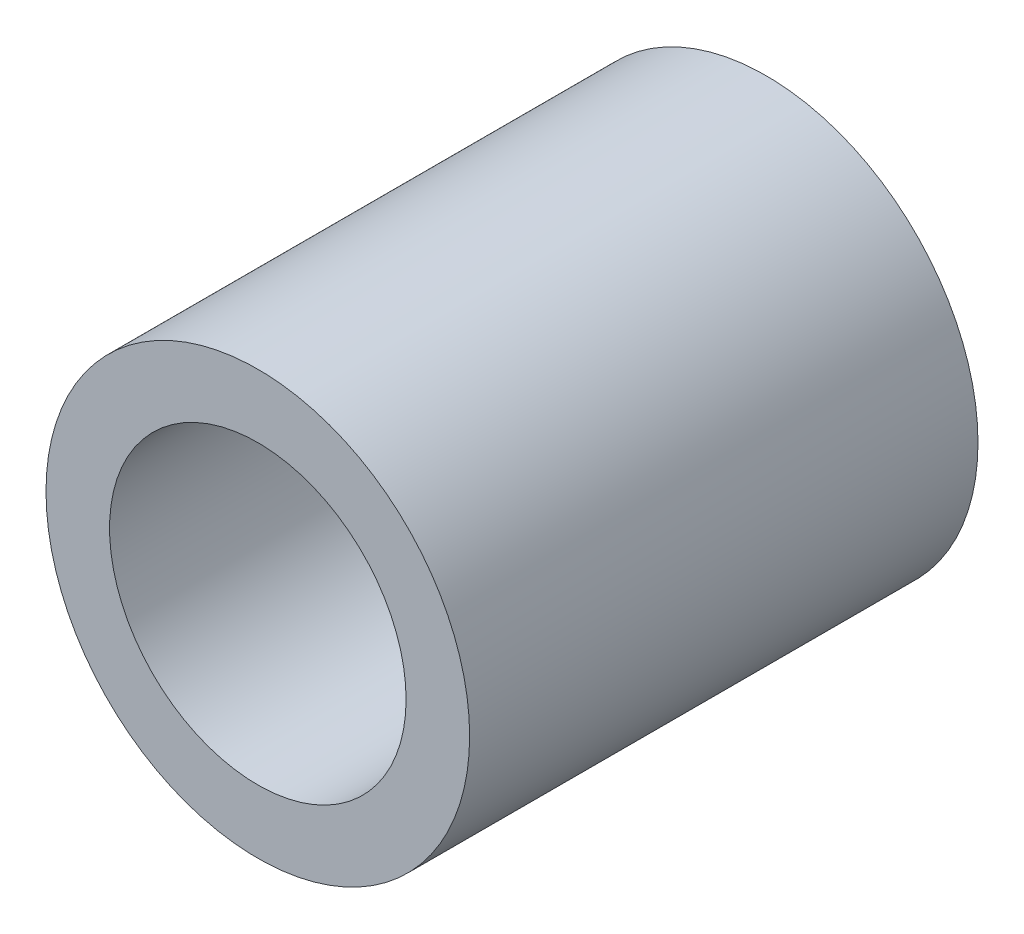
ISO-10303-21;
HEADER;
FILE_DESCRIPTION(('STEP AP214'),'2;1');
FILE_NAME('part.step','',(''),(''),'','','');
FILE_SCHEMA(('AUTOMOTIVE_DESIGN { 1 0 10303 214 1 1 1 1 }'));
ENDSEC;
DATA;
#1=APPLICATION_CONTEXT('core data for automotive mechanical design processes');
#2=APPLICATION_PROTOCOL_DEFINITION('international standard','automotive_design',2000,#1);
#3=PRODUCT_CONTEXT('',#1,'mechanical');
#4=PRODUCT('Part','Part','',(#3));
#5=PRODUCT_RELATED_PRODUCT_CATEGORY('part','',(#4));
#6=PRODUCT_DEFINITION_FORMATION('','',#4);
#7=PRODUCT_DEFINITION_CONTEXT('part definition',#1,'design');
#8=PRODUCT_DEFINITION('design','',#6,#7);
#9=PRODUCT_DEFINITION_SHAPE('','',#8);
#10=(LENGTH_UNIT() NAMED_UNIT(*) SI_UNIT(.MILLI.,.METRE.));
#11=(NAMED_UNIT(*) PLANE_ANGLE_UNIT() SI_UNIT($,.RADIAN.));
#12=(NAMED_UNIT(*) SI_UNIT($,.STERADIAN.) SOLID_ANGLE_UNIT());
#13=UNCERTAINTY_MEASURE_WITH_UNIT(LENGTH_MEASURE(1.E-05),#10,'distance_accuracy_value','');
#14=(GEOMETRIC_REPRESENTATION_CONTEXT(3) GLOBAL_UNCERTAINTY_ASSIGNED_CONTEXT((#13)) GLOBAL_UNIT_ASSIGNED_CONTEXT((#10,
#11,#12)) REPRESENTATION_CONTEXT('',''));
#15=CARTESIAN_POINT('',(0.,0.,0.));
#16=DIRECTION('',(0.,0.,1.));
#17=DIRECTION('',(1.,0.,0.));
#18=AXIS2_PLACEMENT_3D('',#15,#16,#17);
#19=CARTESIAN_POINT('',(0.,0.,0.));
#20=DIRECTION('',(0.,0.,-1.));
#21=DIRECTION('',(1.,0.,0.));
#22=AXIS2_PLACEMENT_3D('',#19,#20,#21);
#23=CYLINDRICAL_SURFACE('',#22,1.75);
#24=CARTESIAN_POINT('',(0.,0.,0.));
#25=DIRECTION('',(0.,0.,1.));
#26=DIRECTION('',(1.,0.,0.));
#27=AXIS2_PLACEMENT_3D('',#24,#25,#26);
#28=CIRCLE('',#27,1.75);
#29=CARTESIAN_POINT('',(1.75,0.,0.));
#30=VERTEX_POINT('',#29);
#31=EDGE_CURVE('E61',#30,#30,#28,.T.);
#32=ORIENTED_EDGE('',*,*,#31,.F.);
#33=DIRECTION('',(0.,0.,1.));
#34=VECTOR('',#33,1.);
#35=CARTESIAN_POINT('',(1.75,0.,0.));
#36=LINE('',#35,#34);
#37=CARTESIAN_POINT('',(1.75,0.,6.));
#38=VERTEX_POINT('',#37);
#39=EDGE_CURVE('E10',#30,#38,#36,.T.);
#40=ORIENTED_EDGE('',*,*,#39,.T.);
#41=CARTESIAN_POINT('',(0.,0.,6.));
#42=DIRECTION('',(0.,0.,-1.));
#43=DIRECTION('',(1.,0.,0.));
#44=AXIS2_PLACEMENT_3D('',#41,#42,#43);
#45=CIRCLE('',#44,1.75);
#46=EDGE_CURVE('E23',#38,#38,#45,.T.);
#47=ORIENTED_EDGE('',*,*,#46,.F.);
#48=ORIENTED_EDGE('',*,*,#39,.F.);
#49=EDGE_LOOP('',(#32,#40,#47,#48));
#50=FACE_BOUND('',#49,.T.);
#51=ADVANCED_FACE('F15',(#50),#23,.F.);
#52=CARTESIAN_POINT('',(0.,0.,6.));
#53=DIRECTION('',(0.,0.,1.));
#54=DIRECTION('',(1.,0.,0.));
#55=AXIS2_PLACEMENT_3D('',#52,#53,#54);
#56=PLANE('',#55);
#57=ORIENTED_EDGE('',*,*,#46,.T.);
#58=EDGE_LOOP('',(#57));
#59=FACE_BOUND('',#58,.T.);
#60=CARTESIAN_POINT('',(0.,0.,6.));
#61=DIRECTION('',(0.,0.,1.));
#62=DIRECTION('',(1.,0.,0.));
#63=AXIS2_PLACEMENT_3D('',#60,#61,#62);
#64=CIRCLE('',#63,2.5);
#65=CARTESIAN_POINT('',(2.5,0.,6.));
#66=VERTEX_POINT('',#65);
#67=EDGE_CURVE('E55',#66,#66,#64,.T.);
#68=ORIENTED_EDGE('',*,*,#67,.T.);
#69=EDGE_LOOP('',(#68));
#70=FACE_BOUND('',#69,.T.);
#71=ADVANCED_FACE('F69',(#59,#70),#56,.T.);
#72=CARTESIAN_POINT('',(0.,0.,0.));
#73=DIRECTION('',(0.,0.,1.));
#74=DIRECTION('',(1.,0.,0.));
#75=AXIS2_PLACEMENT_3D('',#72,#73,#74);
#76=PLANE('',#75);
#77=ORIENTED_EDGE('',*,*,#31,.T.);
#78=EDGE_LOOP('',(#77));
#79=FACE_BOUND('',#78,.T.);
#80=CARTESIAN_POINT('',(0.,0.,0.));
#81=DIRECTION('',(0.,0.,1.));
#82=DIRECTION('',(1.,0.,0.));
#83=AXIS2_PLACEMENT_3D('',#80,#81,#82);
#84=CIRCLE('',#83,2.5);
#85=CARTESIAN_POINT('',(2.5,0.,0.));
#86=VERTEX_POINT('',#85);
#87=EDGE_CURVE('E54',#86,#86,#84,.T.);
#88=ORIENTED_EDGE('',*,*,#87,.F.);
#89=EDGE_LOOP('',(#88));
#90=FACE_BOUND('',#89,.T.);
#91=ADVANCED_FACE('F76',(#79,#90),#76,.F.);
#92=CARTESIAN_POINT('',(0.,0.,0.));
#93=DIRECTION('',(0.,0.,-1.));
#94=DIRECTION('',(1.,0.,0.));
#95=AXIS2_PLACEMENT_3D('',#92,#93,#94);
#96=CYLINDRICAL_SURFACE('',#95,2.5);
#97=ORIENTED_EDGE('',*,*,#87,.T.);
#98=DIRECTION('',(0.,0.,1.));
#99=VECTOR('',#98,1.);
#100=CARTESIAN_POINT('',(2.5,0.,0.));
#101=LINE('',#100,#99);
#102=EDGE_CURVE('E51',#86,#66,#101,.T.);
#103=ORIENTED_EDGE('',*,*,#102,.T.);
#104=ORIENTED_EDGE('',*,*,#67,.F.);
#105=ORIENTED_EDGE('',*,*,#102,.F.);
#106=EDGE_LOOP('',(#97,#103,#104,#105));
#107=FACE_BOUND('',#106,.T.);
#108=ADVANCED_FACE('F52',(#107),#96,.T.);
#109=CLOSED_SHELL('',(#51,#71,#91,#108));
#110=MANIFOLD_SOLID_BREP('B1',#109);
#111=ADVANCED_BREP_SHAPE_REPRESENTATION('',(#18,#110),#14);
#112=SHAPE_DEFINITION_REPRESENTATION(#9,#111);
ENDSEC;
END-ISO-10303-21;
